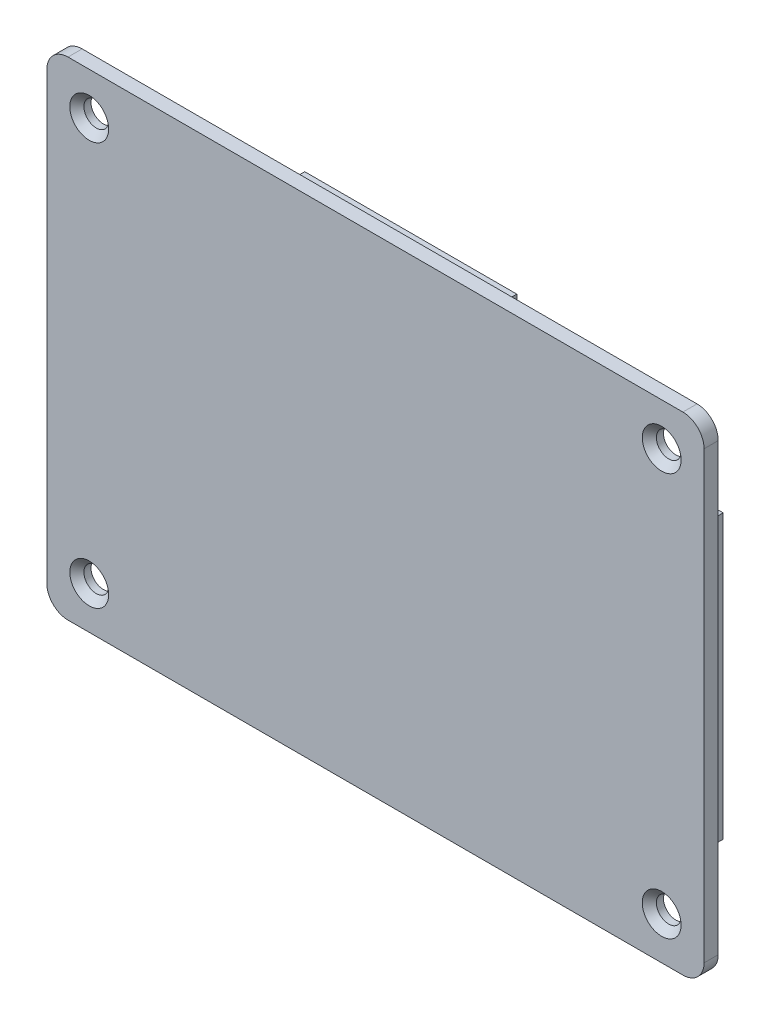
ISO-10303-21;
HEADER;
FILE_DESCRIPTION(('STEP AP214'),'2;1');
FILE_NAME('part.step','',(''),(''),'','','');
FILE_SCHEMA(('AUTOMOTIVE_DESIGN { 1 0 10303 214 1 1 1 1 }'));
ENDSEC;
DATA;
#1=APPLICATION_CONTEXT('core data for automotive mechanical design processes');
#2=APPLICATION_PROTOCOL_DEFINITION('international standard','automotive_design',2000,#1);
#3=PRODUCT_CONTEXT('',#1,'mechanical');
#4=PRODUCT('Part','Part','',(#3));
#5=PRODUCT_RELATED_PRODUCT_CATEGORY('part','',(#4));
#6=PRODUCT_DEFINITION_FORMATION('','',#4);
#7=PRODUCT_DEFINITION_CONTEXT('part definition',#1,'design');
#8=PRODUCT_DEFINITION('design','',#6,#7);
#9=PRODUCT_DEFINITION_SHAPE('','',#8);
#10=(LENGTH_UNIT() NAMED_UNIT(*) SI_UNIT(.MILLI.,.METRE.));
#11=(NAMED_UNIT(*) PLANE_ANGLE_UNIT() SI_UNIT($,.RADIAN.));
#12=(NAMED_UNIT(*) SI_UNIT($,.STERADIAN.) SOLID_ANGLE_UNIT());
#13=UNCERTAINTY_MEASURE_WITH_UNIT(LENGTH_MEASURE(1.E-05),#10,'distance_accuracy_value','');
#14=(GEOMETRIC_REPRESENTATION_CONTEXT(3) GLOBAL_UNCERTAINTY_ASSIGNED_CONTEXT((#13)) GLOBAL_UNIT_ASSIGNED_CONTEXT((#10,
#11,#12)) REPRESENTATION_CONTEXT('',''));
#15=CARTESIAN_POINT('',(0.,0.,0.));
#16=DIRECTION('',(0.,0.,1.));
#17=DIRECTION('',(1.,0.,0.));
#18=AXIS2_PLACEMENT_3D('',#15,#16,#17);
#19=CARTESIAN_POINT('',(62.230528187675,-22.7531322658769,0.));
#20=DIRECTION('',(0.,0.,1.));
#21=DIRECTION('',(1.,0.,0.));
#22=AXIS2_PLACEMENT_3D('',#19,#20,#21);
#23=PLANE('',#22);
#24=CARTESIAN_POINT('',(59.2305281876754,-82.7531332658758,0.));
#25=DIRECTION('',(0.,0.,-1.));
#26=DIRECTION('',(-1.,0.,0.));
#27=AXIS2_PLACEMENT_3D('',#24,#25,#26);
#28=CIRCLE('',#27,1.75);
#29=CARTESIAN_POINT('',(57.4805281876753,-82.7531332658758,0.));
#30=VERTEX_POINT('',#29);
#31=EDGE_CURVE('E469',#30,#30,#28,.T.);
#32=ORIENTED_EDGE('',*,*,#31,.F.);
#33=EDGE_LOOP('',(#32));
#34=FACE_BOUND('',#33,.T.);
#35=CARTESIAN_POINT('',(-21.7694704923239,-82.7531332658761,0.));
#36=DIRECTION('',(0.,0.,-1.));
#37=DIRECTION('',(-1.,0.,0.));
#38=AXIS2_PLACEMENT_3D('',#35,#36,#37);
#39=CIRCLE('',#38,1.75);
#40=CARTESIAN_POINT('',(-23.5194704923239,-82.7531332658761,0.));
#41=VERTEX_POINT('',#40);
#42=EDGE_CURVE('E470',#41,#41,#39,.T.);
#43=ORIENTED_EDGE('',*,*,#42,.F.);
#44=EDGE_LOOP('',(#43));
#45=FACE_BOUND('',#44,.T.);
#46=CARTESIAN_POINT('',(-21.7694707064445,-25.703133911756,0.));
#47=DIRECTION('',(0.,0.,-1.));
#48=DIRECTION('',(-1.,0.,0.));
#49=AXIS2_PLACEMENT_3D('',#46,#47,#48);
#50=CIRCLE('',#49,1.75);
#51=CARTESIAN_POINT('',(-23.5194707064445,-25.703133911756,0.));
#52=VERTEX_POINT('',#51);
#53=EDGE_CURVE('E473',#52,#52,#50,.T.);
#54=ORIENTED_EDGE('',*,*,#53,.F.);
#55=EDGE_LOOP('',(#54));
#56=FACE_BOUND('',#55,.T.);
#57=CARTESIAN_POINT('',(59.2305281876754,-25.7531322658771,0.));
#58=DIRECTION('',(0.,0.,-1.));
#59=DIRECTION('',(-1.,0.,0.));
#60=AXIS2_PLACEMENT_3D('',#57,#58,#59);
#61=CIRCLE('',#60,1.75);
#62=CARTESIAN_POINT('',(57.4805281876754,-25.7531322658771,0.));
#63=VERTEX_POINT('',#62);
#64=EDGE_CURVE('E477',#63,#63,#61,.T.);
#65=ORIENTED_EDGE('',*,*,#64,.F.);
#66=EDGE_LOOP('',(#65));
#67=FACE_BOUND('',#66,.T.);
#68=DIRECTION('',(0.,1.,0.));
#69=VECTOR('',#68,1.);
#70=CARTESIAN_POINT('',(3.73052884767558,-24.0531322658769,0.));
#71=LINE('',#70,#69);
#72=CARTESIAN_POINT('',(3.73052884767558,-24.0531322658769,0.));
#73=VERTEX_POINT('',#72);
#74=CARTESIAN_POINT('',(3.73052884767558,-22.0531322658769,0.));
#75=VERTEX_POINT('',#74);
#76=EDGE_CURVE('E215',#73,#75,#71,.T.);
#77=ORIENTED_EDGE('',*,*,#76,.F.);
#78=DIRECTION('',(-1.,0.,0.));
#79=VECTOR('',#78,1.);
#80=CARTESIAN_POINT('',(33.7305288476756,-24.0531322658769,0.));
#81=LINE('',#80,#79);
#82=CARTESIAN_POINT('',(33.7305288476756,-24.0531322658769,0.));
#83=VERTEX_POINT('',#82);
#84=EDGE_CURVE('E228',#83,#73,#81,.T.);
#85=ORIENTED_EDGE('',*,*,#84,.F.);
#86=DIRECTION('',(0.,-1.,0.));
#87=VECTOR('',#86,1.);
#88=CARTESIAN_POINT('',(33.7305288476756,-24.0531322658769,0.));
#89=LINE('',#88,#87);
#90=CARTESIAN_POINT('',(33.7305288476756,-22.0531322658769,0.));
#91=VERTEX_POINT('',#90);
#92=EDGE_CURVE('E237',#91,#83,#89,.T.);
#93=ORIENTED_EDGE('',*,*,#92,.F.);
#94=DIRECTION('',(1.,0.,0.));
#95=VECTOR('',#94,1.);
#96=CARTESIAN_POINT('',(33.7305288476756,-22.0531322658769,0.));
#97=LINE('',#96,#95);
#98=EDGE_CURVE('E218',#75,#91,#97,.T.);
#99=ORIENTED_EDGE('',*,*,#98,.F.);
#100=EDGE_LOOP('',(#77,#85,#93,#99));
#101=FACE_BOUND('',#100,.T.);
#102=DIRECTION('',(0.,-1.,0.));
#103=VECTOR('',#102,1.);
#104=CARTESIAN_POINT('',(62.930528187675,-74.2531327658765,0.));
#105=LINE('',#104,#103);
#106=CARTESIAN_POINT('',(62.930528187675,-34.2531327658765,0.));
#107=VERTEX_POINT('',#106);
#108=CARTESIAN_POINT('',(62.930528187675,-74.2531327658765,0.));
#109=VERTEX_POINT('',#108);
#110=EDGE_CURVE('E286',#107,#109,#105,.T.);
#111=ORIENTED_EDGE('',*,*,#110,.F.);
#112=DIRECTION('',(1.,0.,0.));
#113=VECTOR('',#112,1.);
#114=CARTESIAN_POINT('',(62.930528187675,-34.2531327658765,0.));
#115=LINE('',#114,#113);
#116=CARTESIAN_POINT('',(60.930528187675,-34.2531327658765,0.));
#117=VERTEX_POINT('',#116);
#118=EDGE_CURVE('E291',#117,#107,#115,.T.);
#119=ORIENTED_EDGE('',*,*,#118,.F.);
#120=DIRECTION('',(0.,1.,0.));
#121=VECTOR('',#120,1.);
#122=CARTESIAN_POINT('',(60.930528187675,-74.2531327658765,0.));
#123=LINE('',#122,#121);
#124=CARTESIAN_POINT('',(60.930528187675,-74.2531327658765,0.));
#125=VERTEX_POINT('',#124);
#126=EDGE_CURVE('E303',#125,#117,#123,.T.);
#127=ORIENTED_EDGE('',*,*,#126,.F.);
#128=DIRECTION('',(-1.,0.,0.));
#129=VECTOR('',#128,1.);
#130=CARTESIAN_POINT('',(62.930528187675,-74.2531327658765,0.));
#131=LINE('',#130,#129);
#132=EDGE_CURVE('E300',#109,#125,#131,.T.);
#133=ORIENTED_EDGE('',*,*,#132,.F.);
#134=EDGE_LOOP('',(#111,#119,#127,#133));
#135=FACE_BOUND('',#134,.T.);
#136=CARTESIAN_POINT('',(62.230528187675,-22.7531322658769,0.));
#137=DIRECTION('',(0.,0.,1.));
#138=DIRECTION('',(1.,0.,0.));
#139=AXIS2_PLACEMENT_3D('',#136,#137,#138);
#140=CIRCLE('',#139,3.00000000000001);
#141=CARTESIAN_POINT('',(65.230528187675,-22.7531322658769,0.));
#142=VERTEX_POINT('',#141);
#143=CARTESIAN_POINT('',(62.230528187675,-19.7531322658769,0.));
#144=VERTEX_POINT('',#143);
#145=EDGE_CURVE('E319',#142,#144,#140,.T.);
#146=ORIENTED_EDGE('',*,*,#145,.F.);
#147=DIRECTION('',(0.,1.,0.));
#148=VECTOR('',#147,1.);
#149=CARTESIAN_POINT('',(65.230528187675,-85.7531332658761,0.));
#150=LINE('',#149,#148);
#151=CARTESIAN_POINT('',(65.230528187675,-85.7531332658761,0.));
#152=VERTEX_POINT('',#151);
#153=EDGE_CURVE('E324',#152,#142,#150,.T.);
#154=ORIENTED_EDGE('',*,*,#153,.F.);
#155=CARTESIAN_POINT('',(62.230528187675,-85.7531332658761,0.));
#156=DIRECTION('',(0.,0.,1.));
#157=DIRECTION('',(1.,0.,0.));
#158=AXIS2_PLACEMENT_3D('',#155,#156,#157);
#159=CIRCLE('',#158,3.00000000000002);
#160=CARTESIAN_POINT('',(62.230528187675,-88.7531332658761,0.));
#161=VERTEX_POINT('',#160);
#162=EDGE_CURVE('E351',#161,#152,#159,.T.);
#163=ORIENTED_EDGE('',*,*,#162,.F.);
#164=DIRECTION('',(1.,0.,0.));
#165=VECTOR('',#164,1.);
#166=CARTESIAN_POINT('',(-24.7694704923239,-88.7531332658761,0.));
#167=LINE('',#166,#165);
#168=CARTESIAN_POINT('',(-24.7694704923239,-88.7531332658761,0.));
#169=VERTEX_POINT('',#168);
#170=EDGE_CURVE('E349',#169,#161,#167,.T.);
#171=ORIENTED_EDGE('',*,*,#170,.F.);
#172=CARTESIAN_POINT('',(-24.7694704923239,-85.7531332658761,0.));
#173=DIRECTION('',(0.,0.,1.));
#174=DIRECTION('',(1.,0.,0.));
#175=AXIS2_PLACEMENT_3D('',#172,#173,#174);
#176=CIRCLE('',#175,3.00000000000002);
#177=CARTESIAN_POINT('',(-27.7694704923239,-85.7531332658761,0.));
#178=VERTEX_POINT('',#177);
#179=EDGE_CURVE('E347',#178,#169,#176,.T.);
#180=ORIENTED_EDGE('',*,*,#179,.F.);
#181=DIRECTION('',(0.,-1.,0.));
#182=VECTOR('',#181,1.);
#183=CARTESIAN_POINT('',(-27.7694704923239,-22.7531322658769,0.));
#184=LINE('',#183,#182);
#185=CARTESIAN_POINT('',(-27.7694704923239,-22.7531322658769,0.));
#186=VERTEX_POINT('',#185);
#187=EDGE_CURVE('E345',#186,#178,#184,.T.);
#188=ORIENTED_EDGE('',*,*,#187,.F.);
#189=CARTESIAN_POINT('',(-24.7694704923239,-22.7531322658769,0.));
#190=DIRECTION('',(0.,0.,1.));
#191=DIRECTION('',(1.,0.,0.));
#192=AXIS2_PLACEMENT_3D('',#189,#190,#191);
#193=CIRCLE('',#192,3.00000000000003);
#194=CARTESIAN_POINT('',(-24.7694704923239,-19.7531322658769,0.));
#195=VERTEX_POINT('',#194);
#196=EDGE_CURVE('E343',#195,#186,#193,.T.);
#197=ORIENTED_EDGE('',*,*,#196,.F.);
#198=DIRECTION('',(-1.,0.,0.));
#199=VECTOR('',#198,1.);
#200=CARTESIAN_POINT('',(62.230528187675,-19.7531322658769,0.));
#201=LINE('',#200,#199);
#202=EDGE_CURVE('E341',#144,#195,#201,.T.);
#203=ORIENTED_EDGE('',*,*,#202,.F.);
#204=EDGE_LOOP('',(#146,#154,#163,#171,#180,#188,#197,#203));
#205=FACE_BOUND('',#204,.T.);
#206=DIRECTION('',(-1.,0.,0.));
#207=VECTOR('',#206,1.);
#208=CARTESIAN_POINT('',(-25.4694704923239,-74.2531327658765,0.));
#209=LINE('',#208,#207);
#210=CARTESIAN_POINT('',(-23.4694704923239,-74.2531327658765,0.));
#211=VERTEX_POINT('',#210);
#212=CARTESIAN_POINT('',(-25.4694704923239,-74.2531327658765,0.));
#213=VERTEX_POINT('',#212);
#214=EDGE_CURVE('E253',#211,#213,#209,.T.);
#215=ORIENTED_EDGE('',*,*,#214,.F.);
#216=DIRECTION('',(0.,-1.,0.));
#217=VECTOR('',#216,1.);
#218=CARTESIAN_POINT('',(-23.4694704923239,-74.2531327658765,0.));
#219=LINE('',#218,#217);
#220=CARTESIAN_POINT('',(-23.4694704923239,-34.2531327658765,0.));
#221=VERTEX_POINT('',#220);
#222=EDGE_CURVE('E258',#221,#211,#219,.T.);
#223=ORIENTED_EDGE('',*,*,#222,.F.);
#224=DIRECTION('',(1.,0.,0.));
#225=VECTOR('',#224,1.);
#226=CARTESIAN_POINT('',(-25.4694704923239,-34.2531327658765,0.));
#227=LINE('',#226,#225);
#228=CARTESIAN_POINT('',(-25.4694704923239,-34.2531327658765,0.));
#229=VERTEX_POINT('',#228);
#230=EDGE_CURVE('E270',#229,#221,#227,.T.);
#231=ORIENTED_EDGE('',*,*,#230,.F.);
#232=DIRECTION('',(0.,1.,0.));
#233=VECTOR('',#232,1.);
#234=CARTESIAN_POINT('',(-25.4694704923239,-74.2531327658765,0.));
#235=LINE('',#234,#233);
#236=EDGE_CURVE('E267',#213,#229,#235,.T.);
#237=ORIENTED_EDGE('',*,*,#236,.F.);
#238=EDGE_LOOP('',(#215,#223,#231,#237));
#239=FACE_BOUND('',#238,.T.);
#240=DIRECTION('',(0.,-1.,0.));
#241=VECTOR('',#240,1.);
#242=CARTESIAN_POINT('',(33.7305288476756,-84.4531332658761,0.));
#243=LINE('',#242,#241);
#244=CARTESIAN_POINT('',(33.7305288476756,-84.4531332658761,0.));
#245=VERTEX_POINT('',#244);
#246=CARTESIAN_POINT('',(33.7305288476756,-86.4531332658761,0.));
#247=VERTEX_POINT('',#246);
#248=EDGE_CURVE('E214',#245,#247,#243,.T.);
#249=ORIENTED_EDGE('',*,*,#248,.F.);
#250=DIRECTION('',(1.,0.,0.));
#251=VECTOR('',#250,1.);
#252=CARTESIAN_POINT('',(33.7305288476756,-84.4531332658761,0.));
#253=LINE('',#252,#251);
#254=CARTESIAN_POINT('',(3.73052884767557,-84.4531332658761,0.));
#255=VERTEX_POINT('',#254);
#256=EDGE_CURVE('E211',#255,#245,#253,.T.);
#257=ORIENTED_EDGE('',*,*,#256,.F.);
#258=DIRECTION('',(0.,1.,0.));
#259=VECTOR('',#258,1.);
#260=CARTESIAN_POINT('',(3.73052884767557,-84.4531332658761,0.));
#261=LINE('',#260,#259);
#262=CARTESIAN_POINT('',(3.73052884767557,-86.4531332658761,0.));
#263=VERTEX_POINT('',#262);
#264=EDGE_CURVE('E53',#263,#255,#261,.T.);
#265=ORIENTED_EDGE('',*,*,#264,.F.);
#266=DIRECTION('',(-1.,0.,0.));
#267=VECTOR('',#266,1.);
#268=CARTESIAN_POINT('',(33.7305288476756,-86.4531332658761,0.));
#269=LINE('',#268,#267);
#270=EDGE_CURVE('E48',#247,#263,#269,.T.);
#271=ORIENTED_EDGE('',*,*,#270,.F.);
#272=EDGE_LOOP('',(#249,#257,#265,#271));
#273=FACE_BOUND('',#272,.T.);
#274=ADVANCED_FACE('F33',(#34,#45,#56,#67,#101,#135,#205,#239,#273),#23,.F.);
#275=CARTESIAN_POINT('',(62.230528187675,-22.7531322658769,2.));
#276=DIRECTION('',(0.,0.,-1.));
#277=DIRECTION('',(-1.,0.,0.));
#278=AXIS2_PLACEMENT_3D('',#275,#276,#277);
#279=CYLINDRICAL_SURFACE('',#278,3.00000000000001);
#280=ORIENTED_EDGE('',*,*,#145,.T.);
#281=DIRECTION('',(0.,0.,-1.));
#282=VECTOR('',#281,1.);
#283=CARTESIAN_POINT('',(62.230528187675,-19.7531322658769,2.));
#284=LINE('',#283,#282);
#285=CARTESIAN_POINT('',(62.230528187675,-19.7531322658769,2.));
#286=VERTEX_POINT('',#285);
#287=EDGE_CURVE('E374',#286,#144,#284,.T.);
#288=ORIENTED_EDGE('',*,*,#287,.F.);
#289=CARTESIAN_POINT('',(62.230528187675,-22.7531322658769,2.));
#290=DIRECTION('',(0.,0.,1.));
#291=DIRECTION('',(1.,0.,0.));
#292=AXIS2_PLACEMENT_3D('',#289,#290,#291);
#293=CIRCLE('',#292,3.00000000000001);
#294=CARTESIAN_POINT('',(65.230528187675,-22.7531322658769,2.));
#295=VERTEX_POINT('',#294);
#296=EDGE_CURVE('E320',#295,#286,#293,.T.);
#297=ORIENTED_EDGE('',*,*,#296,.F.);
#298=DIRECTION('',(0.,0.,-1.));
#299=VECTOR('',#298,1.);
#300=CARTESIAN_POINT('',(65.230528187675,-22.7531322658769,2.));
#301=LINE('',#300,#299);
#302=EDGE_CURVE('E338',#295,#142,#301,.T.);
#303=ORIENTED_EDGE('',*,*,#302,.T.);
#304=EDGE_LOOP('',(#280,#288,#297,#303));
#305=FACE_BOUND('',#304,.T.);
#306=ADVANCED_FACE('F414',(#305),#279,.T.);
#307=CARTESIAN_POINT('',(62.230528187675,-19.7531322658769,2.));
#308=DIRECTION('',(0.,-1.,0.));
#309=DIRECTION('',(0.,0.,-1.));
#310=AXIS2_PLACEMENT_3D('',#307,#308,#309);
#311=PLANE('',#310);
#312=ORIENTED_EDGE('',*,*,#202,.T.);
#313=DIRECTION('',(0.,0.,-1.));
#314=VECTOR('',#313,1.);
#315=CARTESIAN_POINT('',(-24.7694704923239,-19.7531322658769,2.));
#316=LINE('',#315,#314);
#317=CARTESIAN_POINT('',(-24.7694704923239,-19.7531322658769,2.));
#318=VERTEX_POINT('',#317);
#319=EDGE_CURVE('E371',#318,#195,#316,.T.);
#320=ORIENTED_EDGE('',*,*,#319,.F.);
#321=DIRECTION('',(-1.,0.,0.));
#322=VECTOR('',#321,1.);
#323=CARTESIAN_POINT('',(62.230528187675,-19.7531322658769,2.));
#324=LINE('',#323,#322);
#325=EDGE_CURVE('E323',#286,#318,#324,.T.);
#326=ORIENTED_EDGE('',*,*,#325,.F.);
#327=ORIENTED_EDGE('',*,*,#287,.T.);
#328=EDGE_LOOP('',(#312,#320,#326,#327));
#329=FACE_BOUND('',#328,.T.);
#330=ADVANCED_FACE('F420',(#329),#311,.F.);
#331=CARTESIAN_POINT('',(-24.7694704923239,-22.7531322658769,2.));
#332=DIRECTION('',(0.,0.,-1.));
#333=DIRECTION('',(-1.,0.,0.));
#334=AXIS2_PLACEMENT_3D('',#331,#332,#333);
#335=CYLINDRICAL_SURFACE('',#334,3.00000000000003);
#336=ORIENTED_EDGE('',*,*,#196,.T.);
#337=DIRECTION('',(0.,0.,-1.));
#338=VECTOR('',#337,1.);
#339=CARTESIAN_POINT('',(-27.7694704923239,-22.7531322658769,2.));
#340=LINE('',#339,#338);
#341=CARTESIAN_POINT('',(-27.7694704923239,-22.7531322658769,2.));
#342=VERTEX_POINT('',#341);
#343=EDGE_CURVE('E368',#342,#186,#340,.T.);
#344=ORIENTED_EDGE('',*,*,#343,.F.);
#345=CARTESIAN_POINT('',(-24.7694704923239,-22.7531322658769,2.));
#346=DIRECTION('',(0.,0.,1.));
#347=DIRECTION('',(1.,0.,0.));
#348=AXIS2_PLACEMENT_3D('',#345,#346,#347);
#349=CIRCLE('',#348,3.00000000000003);
#350=EDGE_CURVE('E326',#318,#342,#349,.T.);
#351=ORIENTED_EDGE('',*,*,#350,.F.);
#352=ORIENTED_EDGE('',*,*,#319,.T.);
#353=EDGE_LOOP('',(#336,#344,#351,#352));
#354=FACE_BOUND('',#353,.T.);
#355=ADVANCED_FACE('F448',(#354),#335,.T.);
#356=CARTESIAN_POINT('',(-27.7694704923239,-22.7531322658769,2.));
#357=DIRECTION('',(1.,0.,0.));
#358=DIRECTION('',(0.,0.,-1.));
#359=AXIS2_PLACEMENT_3D('',#356,#357,#358);
#360=PLANE('',#359);
#361=ORIENTED_EDGE('',*,*,#187,.T.);
#362=DIRECTION('',(0.,0.,-1.));
#363=VECTOR('',#362,1.);
#364=CARTESIAN_POINT('',(-27.7694704923239,-85.7531332658761,2.));
#365=LINE('',#364,#363);
#366=CARTESIAN_POINT('',(-27.7694704923239,-85.7531332658761,2.));
#367=VERTEX_POINT('',#366);
#368=EDGE_CURVE('E365',#367,#178,#365,.T.);
#369=ORIENTED_EDGE('',*,*,#368,.F.);
#370=DIRECTION('',(0.,-1.,0.));
#371=VECTOR('',#370,1.);
#372=CARTESIAN_POINT('',(-27.7694704923239,-22.7531322658769,2.));
#373=LINE('',#372,#371);
#374=EDGE_CURVE('E328',#342,#367,#373,.T.);
#375=ORIENTED_EDGE('',*,*,#374,.F.);
#376=ORIENTED_EDGE('',*,*,#343,.T.);
#377=EDGE_LOOP('',(#361,#369,#375,#376));
#378=FACE_BOUND('',#377,.T.);
#379=ADVANCED_FACE('F444',(#378),#360,.F.);
#380=CARTESIAN_POINT('',(-24.7694704923239,-85.7531332658761,2.));
#381=DIRECTION('',(0.,0.,-1.));
#382=DIRECTION('',(-1.,0.,0.));
#383=AXIS2_PLACEMENT_3D('',#380,#381,#382);
#384=CYLINDRICAL_SURFACE('',#383,3.00000000000002);
#385=ORIENTED_EDGE('',*,*,#179,.T.);
#386=DIRECTION('',(0.,0.,-1.));
#387=VECTOR('',#386,1.);
#388=CARTESIAN_POINT('',(-24.7694704923239,-88.7531332658761,2.));
#389=LINE('',#388,#387);
#390=CARTESIAN_POINT('',(-24.7694704923239,-88.7531332658761,2.));
#391=VERTEX_POINT('',#390);
#392=EDGE_CURVE('E362',#391,#169,#389,.T.);
#393=ORIENTED_EDGE('',*,*,#392,.F.);
#394=CARTESIAN_POINT('',(-24.7694704923239,-85.7531332658761,2.));
#395=DIRECTION('',(0.,0.,1.));
#396=DIRECTION('',(1.,0.,0.));
#397=AXIS2_PLACEMENT_3D('',#394,#395,#396);
#398=CIRCLE('',#397,3.00000000000002);
#399=EDGE_CURVE('E330',#367,#391,#398,.T.);
#400=ORIENTED_EDGE('',*,*,#399,.F.);
#401=ORIENTED_EDGE('',*,*,#368,.T.);
#402=EDGE_LOOP('',(#385,#393,#400,#401));
#403=FACE_BOUND('',#402,.T.);
#404=ADVANCED_FACE('F440',(#403),#384,.T.);
#405=CARTESIAN_POINT('',(-24.7694704923239,-88.7531332658761,2.));
#406=DIRECTION('',(0.,1.,0.));
#407=DIRECTION('',(0.,0.,1.));
#408=AXIS2_PLACEMENT_3D('',#405,#406,#407);
#409=PLANE('',#408);
#410=ORIENTED_EDGE('',*,*,#170,.T.);
#411=DIRECTION('',(0.,0.,-1.));
#412=VECTOR('',#411,1.);
#413=CARTESIAN_POINT('',(62.230528187675,-88.7531332658761,2.));
#414=LINE('',#413,#412);
#415=CARTESIAN_POINT('',(62.230528187675,-88.7531332658761,2.));
#416=VERTEX_POINT('',#415);
#417=EDGE_CURVE('E359',#416,#161,#414,.T.);
#418=ORIENTED_EDGE('',*,*,#417,.F.);
#419=DIRECTION('',(1.,0.,0.));
#420=VECTOR('',#419,1.);
#421=CARTESIAN_POINT('',(-24.7694704923239,-88.7531332658761,2.));
#422=LINE('',#421,#420);
#423=EDGE_CURVE('E332',#391,#416,#422,.T.);
#424=ORIENTED_EDGE('',*,*,#423,.F.);
#425=ORIENTED_EDGE('',*,*,#392,.T.);
#426=EDGE_LOOP('',(#410,#418,#424,#425));
#427=FACE_BOUND('',#426,.T.);
#428=ADVANCED_FACE('F436',(#427),#409,.F.);
#429=CARTESIAN_POINT('',(62.230528187675,-85.7531332658761,2.));
#430=DIRECTION('',(0.,0.,-1.));
#431=DIRECTION('',(-1.,0.,0.));
#432=AXIS2_PLACEMENT_3D('',#429,#430,#431);
#433=CYLINDRICAL_SURFACE('',#432,3.00000000000002);
#434=ORIENTED_EDGE('',*,*,#162,.T.);
#435=DIRECTION('',(0.,0.,-1.));
#436=VECTOR('',#435,1.);
#437=CARTESIAN_POINT('',(65.230528187675,-85.7531332658761,2.));
#438=LINE('',#437,#436);
#439=CARTESIAN_POINT('',(65.230528187675,-85.7531332658761,2.));
#440=VERTEX_POINT('',#439);
#441=EDGE_CURVE('E356',#440,#152,#438,.T.);
#442=ORIENTED_EDGE('',*,*,#441,.F.);
#443=CARTESIAN_POINT('',(62.230528187675,-85.7531332658761,2.));
#444=DIRECTION('',(0.,0.,1.));
#445=DIRECTION('',(1.,0.,0.));
#446=AXIS2_PLACEMENT_3D('',#443,#444,#445);
#447=CIRCLE('',#446,3.00000000000002);
#448=EDGE_CURVE('E334',#416,#440,#447,.T.);
#449=ORIENTED_EDGE('',*,*,#448,.F.);
#450=ORIENTED_EDGE('',*,*,#417,.T.);
#451=EDGE_LOOP('',(#434,#442,#449,#450));
#452=FACE_BOUND('',#451,.T.);
#453=ADVANCED_FACE('F432',(#452),#433,.T.);
#454=CARTESIAN_POINT('',(65.230528187675,-85.7531332658761,2.));
#455=DIRECTION('',(-1.,0.,0.));
#456=DIRECTION('',(0.,0.,1.));
#457=AXIS2_PLACEMENT_3D('',#454,#455,#456);
#458=PLANE('',#457);
#459=ORIENTED_EDGE('',*,*,#153,.T.);
#460=ORIENTED_EDGE('',*,*,#302,.F.);
#461=DIRECTION('',(0.,1.,0.));
#462=VECTOR('',#461,1.);
#463=CARTESIAN_POINT('',(65.230528187675,-85.7531332658761,2.));
#464=LINE('',#463,#462);
#465=EDGE_CURVE('E336',#440,#295,#464,.T.);
#466=ORIENTED_EDGE('',*,*,#465,.F.);
#467=ORIENTED_EDGE('',*,*,#441,.T.);
#468=EDGE_LOOP('',(#459,#460,#466,#467));
#469=FACE_BOUND('',#468,.T.);
#470=ADVANCED_FACE('F429',(#469),#458,.F.);
#471=CARTESIAN_POINT('',(62.230528187675,-22.7531322658769,2.));
#472=DIRECTION('',(0.,0.,1.));
#473=DIRECTION('',(1.,0.,0.));
#474=AXIS2_PLACEMENT_3D('',#471,#472,#473);
#475=PLANE('',#474);
#476=CARTESIAN_POINT('',(59.2305281876754,-82.7531332658758,2.));
#477=DIRECTION('',(0.,0.,1.));
#478=DIRECTION('',(1.,0.,0.));
#479=AXIS2_PLACEMENT_3D('',#476,#477,#478);
#480=CIRCLE('',#479,2.75);
#481=CARTESIAN_POINT('',(61.9805281876754,-82.7531332658758,2.));
#482=VERTEX_POINT('',#481);
#483=EDGE_CURVE('E389',#482,#482,#480,.F.);
#484=ORIENTED_EDGE('',*,*,#483,.T.);
#485=EDGE_LOOP('',(#484));
#486=FACE_BOUND('',#485,.T.);
#487=CARTESIAN_POINT('',(59.2305281876754,-25.7531322658771,2.));
#488=DIRECTION('',(0.,0.,1.));
#489=DIRECTION('',(1.,0.,0.));
#490=AXIS2_PLACEMENT_3D('',#487,#488,#489);
#491=CIRCLE('',#490,2.75);
#492=CARTESIAN_POINT('',(61.9805281876754,-25.7531322658771,2.));
#493=VERTEX_POINT('',#492);
#494=EDGE_CURVE('E386',#493,#493,#491,.F.);
#495=ORIENTED_EDGE('',*,*,#494,.T.);
#496=EDGE_LOOP('',(#495));
#497=FACE_BOUND('',#496,.T.);
#498=CARTESIAN_POINT('',(-21.7694704923239,-82.7531332658761,2.));
#499=DIRECTION('',(0.,0.,1.));
#500=DIRECTION('',(1.,0.,0.));
#501=AXIS2_PLACEMENT_3D('',#498,#499,#500);
#502=CIRCLE('',#501,2.75);
#503=CARTESIAN_POINT('',(-19.0194704923239,-82.7531332658761,2.));
#504=VERTEX_POINT('',#503);
#505=EDGE_CURVE('E383',#504,#504,#502,.F.);
#506=ORIENTED_EDGE('',*,*,#505,.T.);
#507=EDGE_LOOP('',(#506));
#508=FACE_BOUND('',#507,.T.);
#509=CARTESIAN_POINT('',(-21.7694707064445,-25.703133911756,2.));
#510=DIRECTION('',(0.,0.,1.));
#511=DIRECTION('',(1.,0.,0.));
#512=AXIS2_PLACEMENT_3D('',#509,#510,#511);
#513=CIRCLE('',#512,2.75);
#514=CARTESIAN_POINT('',(-19.0194707064445,-25.703133911756,2.));
#515=VERTEX_POINT('',#514);
#516=EDGE_CURVE('E380',#515,#515,#513,.F.);
#517=ORIENTED_EDGE('',*,*,#516,.T.);
#518=EDGE_LOOP('',(#517));
#519=FACE_BOUND('',#518,.T.);
#520=ORIENTED_EDGE('',*,*,#296,.T.);
#521=ORIENTED_EDGE('',*,*,#325,.T.);
#522=ORIENTED_EDGE('',*,*,#350,.T.);
#523=ORIENTED_EDGE('',*,*,#374,.T.);
#524=ORIENTED_EDGE('',*,*,#399,.T.);
#525=ORIENTED_EDGE('',*,*,#423,.T.);
#526=ORIENTED_EDGE('',*,*,#448,.T.);
#527=ORIENTED_EDGE('',*,*,#465,.T.);
#528=EDGE_LOOP('',(#520,#521,#522,#523,#524,#525,#526,#527));
#529=FACE_BOUND('',#528,.T.);
#530=ADVANCED_FACE('F427',(#486,#497,#508,#519,#529),#475,.T.);
#531=CARTESIAN_POINT('',(62.930528187675,-74.2531327658765,-3.));
#532=DIRECTION('',(-1.,0.,0.));
#533=DIRECTION('',(0.,0.,1.));
#534=AXIS2_PLACEMENT_3D('',#531,#532,#533);
#535=PLANE('',#534);
#536=ORIENTED_EDGE('',*,*,#110,.T.);
#537=DIRECTION('',(0.,0.,1.));
#538=VECTOR('',#537,1.);
#539=CARTESIAN_POINT('',(62.930528187675,-74.2531327658765,-3.));
#540=LINE('',#539,#538);
#541=CARTESIAN_POINT('',(62.930528187675,-74.2531327658765,-3.));
#542=VERTEX_POINT('',#541);
#543=EDGE_CURVE('E316',#542,#109,#540,.T.);
#544=ORIENTED_EDGE('',*,*,#543,.F.);
#545=DIRECTION('',(0.,-1.,0.));
#546=VECTOR('',#545,1.);
#547=CARTESIAN_POINT('',(62.930528187675,-74.2531327658765,-3.));
#548=LINE('',#547,#546);
#549=CARTESIAN_POINT('',(62.930528187675,-34.2531327658765,-3.));
#550=VERTEX_POINT('',#549);
#551=EDGE_CURVE('E287',#550,#542,#548,.T.);
#552=ORIENTED_EDGE('',*,*,#551,.F.);
#553=DIRECTION('',(0.,0.,1.));
#554=VECTOR('',#553,1.);
#555=CARTESIAN_POINT('',(62.930528187675,-34.2531327658765,-3.));
#556=LINE('',#555,#554);
#557=EDGE_CURVE('E297',#550,#107,#556,.T.);
#558=ORIENTED_EDGE('',*,*,#557,.T.);
#559=EDGE_LOOP('',(#536,#544,#552,#558));
#560=FACE_BOUND('',#559,.T.);
#561=ADVANCED_FACE('F560',(#560),#535,.F.);
#562=CARTESIAN_POINT('',(62.930528187675,-74.2531327658765,-3.));
#563=DIRECTION('',(0.,1.,0.));
#564=DIRECTION('',(0.,0.,1.));
#565=AXIS2_PLACEMENT_3D('',#562,#563,#564);
#566=PLANE('',#565);
#567=ORIENTED_EDGE('',*,*,#132,.T.);
#568=DIRECTION('',(0.,0.,1.));
#569=VECTOR('',#568,1.);
#570=CARTESIAN_POINT('',(60.930528187675,-74.2531327658765,-3.));
#571=LINE('',#570,#569);
#572=CARTESIAN_POINT('',(60.930528187675,-74.2531327658765,-3.));
#573=VERTEX_POINT('',#572);
#574=EDGE_CURVE('E313',#573,#125,#571,.T.);
#575=ORIENTED_EDGE('',*,*,#574,.F.);
#576=DIRECTION('',(-1.,0.,0.));
#577=VECTOR('',#576,1.);
#578=CARTESIAN_POINT('',(62.930528187675,-74.2531327658765,-3.));
#579=LINE('',#578,#577);
#580=EDGE_CURVE('E290',#542,#573,#579,.T.);
#581=ORIENTED_EDGE('',*,*,#580,.F.);
#582=ORIENTED_EDGE('',*,*,#543,.T.);
#583=EDGE_LOOP('',(#567,#575,#581,#582));
#584=FACE_BOUND('',#583,.T.);
#585=ADVANCED_FACE('F557',(#584),#566,.F.);
#586=CARTESIAN_POINT('',(60.930528187675,-74.2531327658765,-3.));
#587=DIRECTION('',(1.,0.,0.));
#588=DIRECTION('',(0.,0.,-1.));
#589=AXIS2_PLACEMENT_3D('',#586,#587,#588);
#590=PLANE('',#589);
#591=ORIENTED_EDGE('',*,*,#126,.T.);
#592=DIRECTION('',(0.,0.,1.));
#593=VECTOR('',#592,1.);
#594=CARTESIAN_POINT('',(60.930528187675,-34.2531327658765,-3.));
#595=LINE('',#594,#593);
#596=CARTESIAN_POINT('',(60.930528187675,-34.2531327658765,-3.));
#597=VERTEX_POINT('',#596);
#598=EDGE_CURVE('E310',#597,#117,#595,.T.);
#599=ORIENTED_EDGE('',*,*,#598,.F.);
#600=DIRECTION('',(0.,1.,0.));
#601=VECTOR('',#600,1.);
#602=CARTESIAN_POINT('',(60.930528187675,-74.2531327658765,-3.));
#603=LINE('',#602,#601);
#604=EDGE_CURVE('E293',#573,#597,#603,.T.);
#605=ORIENTED_EDGE('',*,*,#604,.F.);
#606=ORIENTED_EDGE('',*,*,#574,.T.);
#607=EDGE_LOOP('',(#591,#599,#605,#606));
#608=FACE_BOUND('',#607,.T.);
#609=ADVANCED_FACE('F553',(#608),#590,.F.);
#610=CARTESIAN_POINT('',(62.930528187675,-34.2531327658765,-3.));
#611=DIRECTION('',(0.,-1.,0.));
#612=DIRECTION('',(1.,0.,0.));
#613=AXIS2_PLACEMENT_3D('',#610,#611,#612);
#614=PLANE('',#613);
#615=ORIENTED_EDGE('',*,*,#118,.T.);
#616=ORIENTED_EDGE('',*,*,#557,.F.);
#617=DIRECTION('',(1.,0.,0.));
#618=VECTOR('',#617,1.);
#619=CARTESIAN_POINT('',(62.930528187675,-34.2531327658765,-3.));
#620=LINE('',#619,#618);
#621=EDGE_CURVE('E295',#597,#550,#620,.T.);
#622=ORIENTED_EDGE('',*,*,#621,.F.);
#623=ORIENTED_EDGE('',*,*,#598,.T.);
#624=EDGE_LOOP('',(#615,#616,#622,#623));
#625=FACE_BOUND('',#624,.T.);
#626=ADVANCED_FACE('F549',(#625),#614,.F.);
#627=CARTESIAN_POINT('',(0.,0.,-3.));
#628=DIRECTION('',(0.,0.,1.));
#629=DIRECTION('',(1.,0.,0.));
#630=AXIS2_PLACEMENT_3D('',#627,#628,#629);
#631=PLANE('',#630);
#632=ORIENTED_EDGE('',*,*,#551,.T.);
#633=ORIENTED_EDGE('',*,*,#580,.T.);
#634=ORIENTED_EDGE('',*,*,#604,.T.);
#635=ORIENTED_EDGE('',*,*,#621,.T.);
#636=EDGE_LOOP('',(#632,#633,#634,#635));
#637=FACE_BOUND('',#636,.T.);
#638=ADVANCED_FACE('F545',(#637),#631,.F.);
#639=CARTESIAN_POINT('',(-25.4694704923239,-74.2531327658765,-3.));
#640=DIRECTION('',(0.,1.,0.));
#641=DIRECTION('',(0.,0.,1.));
#642=AXIS2_PLACEMENT_3D('',#639,#640,#641);
#643=PLANE('',#642);
#644=ORIENTED_EDGE('',*,*,#214,.T.);
#645=DIRECTION('',(0.,0.,1.));
#646=VECTOR('',#645,1.);
#647=CARTESIAN_POINT('',(-25.4694704923239,-74.2531327658765,-3.));
#648=LINE('',#647,#646);
#649=CARTESIAN_POINT('',(-25.4694704923239,-74.2531327658765,-3.));
#650=VERTEX_POINT('',#649);
#651=EDGE_CURVE('E283',#650,#213,#648,.T.);
#652=ORIENTED_EDGE('',*,*,#651,.F.);
#653=DIRECTION('',(-1.,0.,0.));
#654=VECTOR('',#653,1.);
#655=CARTESIAN_POINT('',(-25.4694704923239,-74.2531327658765,-3.));
#656=LINE('',#655,#654);
#657=CARTESIAN_POINT('',(-23.4694704923239,-74.2531327658765,-3.));
#658=VERTEX_POINT('',#657);
#659=EDGE_CURVE('E254',#658,#650,#656,.T.);
#660=ORIENTED_EDGE('',*,*,#659,.F.);
#661=DIRECTION('',(0.,0.,1.));
#662=VECTOR('',#661,1.);
#663=CARTESIAN_POINT('',(-23.4694704923239,-74.2531327658765,-3.));
#664=LINE('',#663,#662);
#665=EDGE_CURVE('E264',#658,#211,#664,.T.);
#666=ORIENTED_EDGE('',*,*,#665,.T.);
#667=EDGE_LOOP('',(#644,#652,#660,#666));
#668=FACE_BOUND('',#667,.T.);
#669=ADVANCED_FACE('F541',(#668),#643,.F.);
#670=CARTESIAN_POINT('',(-25.4694704923239,-74.2531327658765,-3.));
#671=DIRECTION('',(1.,0.,0.));
#672=DIRECTION('',(0.,0.,-1.));
#673=AXIS2_PLACEMENT_3D('',#670,#671,#672);
#674=PLANE('',#673);
#675=ORIENTED_EDGE('',*,*,#236,.T.);
#676=DIRECTION('',(0.,0.,1.));
#677=VECTOR('',#676,1.);
#678=CARTESIAN_POINT('',(-25.4694704923239,-34.2531327658765,-3.));
#679=LINE('',#678,#677);
#680=CARTESIAN_POINT('',(-25.4694704923239,-34.2531327658765,-3.));
#681=VERTEX_POINT('',#680);
#682=EDGE_CURVE('E280',#681,#229,#679,.T.);
#683=ORIENTED_EDGE('',*,*,#682,.F.);
#684=DIRECTION('',(0.,1.,0.));
#685=VECTOR('',#684,1.);
#686=CARTESIAN_POINT('',(-25.4694704923239,-74.2531327658765,-3.));
#687=LINE('',#686,#685);
#688=EDGE_CURVE('E257',#650,#681,#687,.T.);
#689=ORIENTED_EDGE('',*,*,#688,.F.);
#690=ORIENTED_EDGE('',*,*,#651,.T.);
#691=EDGE_LOOP('',(#675,#683,#689,#690));
#692=FACE_BOUND('',#691,.T.);
#693=ADVANCED_FACE('F537',(#692),#674,.F.);
#694=CARTESIAN_POINT('',(-25.4694704923239,-34.2531327658765,-3.));
#695=DIRECTION('',(0.,-1.,0.));
#696=DIRECTION('',(1.,0.,0.));
#697=AXIS2_PLACEMENT_3D('',#694,#695,#696);
#698=PLANE('',#697);
#699=ORIENTED_EDGE('',*,*,#230,.T.);
#700=DIRECTION('',(0.,0.,1.));
#701=VECTOR('',#700,1.);
#702=CARTESIAN_POINT('',(-23.4694704923239,-34.2531327658765,-3.));
#703=LINE('',#702,#701);
#704=CARTESIAN_POINT('',(-23.4694704923239,-34.2531327658765,-3.));
#705=VERTEX_POINT('',#704);
#706=EDGE_CURVE('E277',#705,#221,#703,.T.);
#707=ORIENTED_EDGE('',*,*,#706,.F.);
#708=DIRECTION('',(1.,0.,0.));
#709=VECTOR('',#708,1.);
#710=CARTESIAN_POINT('',(-25.4694704923239,-34.2531327658765,-3.));
#711=LINE('',#710,#709);
#712=EDGE_CURVE('E260',#681,#705,#711,.T.);
#713=ORIENTED_EDGE('',*,*,#712,.F.);
#714=ORIENTED_EDGE('',*,*,#682,.T.);
#715=EDGE_LOOP('',(#699,#707,#713,#714));
#716=FACE_BOUND('',#715,.T.);
#717=ADVANCED_FACE('F533',(#716),#698,.F.);
#718=CARTESIAN_POINT('',(-23.4694704923239,-74.2531327658765,-3.));
#719=DIRECTION('',(-1.,0.,0.));
#720=DIRECTION('',(0.,0.,1.));
#721=AXIS2_PLACEMENT_3D('',#718,#719,#720);
#722=PLANE('',#721);
#723=ORIENTED_EDGE('',*,*,#222,.T.);
#724=ORIENTED_EDGE('',*,*,#665,.F.);
#725=DIRECTION('',(0.,-1.,0.));
#726=VECTOR('',#725,1.);
#727=CARTESIAN_POINT('',(-23.4694704923239,-74.2531327658765,-3.));
#728=LINE('',#727,#726);
#729=EDGE_CURVE('E262',#705,#658,#728,.T.);
#730=ORIENTED_EDGE('',*,*,#729,.F.);
#731=ORIENTED_EDGE('',*,*,#706,.T.);
#732=EDGE_LOOP('',(#723,#724,#730,#731));
#733=FACE_BOUND('',#732,.T.);
#734=ADVANCED_FACE('F529',(#733),#722,.F.);
#735=CARTESIAN_POINT('',(0.,0.,-3.));
#736=DIRECTION('',(0.,0.,1.));
#737=DIRECTION('',(1.,0.,0.));
#738=AXIS2_PLACEMENT_3D('',#735,#736,#737);
#739=PLANE('',#738);
#740=ORIENTED_EDGE('',*,*,#659,.T.);
#741=ORIENTED_EDGE('',*,*,#688,.T.);
#742=ORIENTED_EDGE('',*,*,#712,.T.);
#743=ORIENTED_EDGE('',*,*,#729,.T.);
#744=EDGE_LOOP('',(#740,#741,#742,#743));
#745=FACE_BOUND('',#744,.T.);
#746=ADVANCED_FACE('F525',(#745),#739,.F.);
#747=CARTESIAN_POINT('',(3.73052884767558,-24.0531322658769,-3.));
#748=DIRECTION('',(1.,0.,0.));
#749=DIRECTION('',(0.,0.,-1.));
#750=AXIS2_PLACEMENT_3D('',#747,#748,#749);
#751=PLANE('',#750);
#752=ORIENTED_EDGE('',*,*,#76,.T.);
#753=DIRECTION('',(0.,0.,1.));
#754=VECTOR('',#753,1.);
#755=CARTESIAN_POINT('',(3.73052884767558,-22.0531322658769,-3.));
#756=LINE('',#755,#754);
#757=CARTESIAN_POINT('',(3.73052884767558,-22.0531322658769,-3.));
#758=VERTEX_POINT('',#757);
#759=EDGE_CURVE('E250',#758,#75,#756,.T.);
#760=ORIENTED_EDGE('',*,*,#759,.F.);
#761=DIRECTION('',(0.,1.,0.));
#762=VECTOR('',#761,1.);
#763=CARTESIAN_POINT('',(3.73052884767558,-24.0531322658769,-3.));
#764=LINE('',#763,#762);
#765=CARTESIAN_POINT('',(3.73052884767558,-24.0531322658769,-3.));
#766=VERTEX_POINT('',#765);
#767=EDGE_CURVE('E224',#766,#758,#764,.T.);
#768=ORIENTED_EDGE('',*,*,#767,.F.);
#769=DIRECTION('',(0.,0.,1.));
#770=VECTOR('',#769,1.);
#771=CARTESIAN_POINT('',(3.73052884767558,-24.0531322658769,-3.));
#772=LINE('',#771,#770);
#773=EDGE_CURVE('E233',#766,#73,#772,.T.);
#774=ORIENTED_EDGE('',*,*,#773,.T.);
#775=EDGE_LOOP('',(#752,#760,#768,#774));
#776=FACE_BOUND('',#775,.T.);
#777=ADVANCED_FACE('F521',(#776),#751,.F.);
#778=CARTESIAN_POINT('',(33.7305288476756,-22.0531322658769,-3.));
#779=DIRECTION('',(0.,-1.,0.));
#780=DIRECTION('',(0.,0.,-1.));
#781=AXIS2_PLACEMENT_3D('',#778,#779,#780);
#782=PLANE('',#781);
#783=ORIENTED_EDGE('',*,*,#98,.T.);
#784=DIRECTION('',(0.,0.,1.));
#785=VECTOR('',#784,1.);
#786=CARTESIAN_POINT('',(33.7305288476756,-22.0531322658769,-3.));
#787=LINE('',#786,#785);
#788=CARTESIAN_POINT('',(33.7305288476756,-22.0531322658769,-3.));
#789=VERTEX_POINT('',#788);
#790=EDGE_CURVE('E247',#789,#91,#787,.T.);
#791=ORIENTED_EDGE('',*,*,#790,.F.);
#792=DIRECTION('',(1.,0.,0.));
#793=VECTOR('',#792,1.);
#794=CARTESIAN_POINT('',(33.7305288476756,-22.0531322658769,-3.));
#795=LINE('',#794,#793);
#796=EDGE_CURVE('E227',#758,#789,#795,.T.);
#797=ORIENTED_EDGE('',*,*,#796,.F.);
#798=ORIENTED_EDGE('',*,*,#759,.T.);
#799=EDGE_LOOP('',(#783,#791,#797,#798));
#800=FACE_BOUND('',#799,.T.);
#801=ADVANCED_FACE('F517',(#800),#782,.F.);
#802=CARTESIAN_POINT('',(33.7305288476756,-24.0531322658769,-3.));
#803=DIRECTION('',(-1.,0.,0.));
#804=DIRECTION('',(0.,0.,1.));
#805=AXIS2_PLACEMENT_3D('',#802,#803,#804);
#806=PLANE('',#805);
#807=ORIENTED_EDGE('',*,*,#92,.T.);
#808=DIRECTION('',(0.,0.,1.));
#809=VECTOR('',#808,1.);
#810=CARTESIAN_POINT('',(33.7305288476756,-24.0531322658769,-3.));
#811=LINE('',#810,#809);
#812=CARTESIAN_POINT('',(33.7305288476756,-24.0531322658769,-3.));
#813=VERTEX_POINT('',#812);
#814=EDGE_CURVE('E244',#813,#83,#811,.T.);
#815=ORIENTED_EDGE('',*,*,#814,.F.);
#816=DIRECTION('',(0.,-1.,0.));
#817=VECTOR('',#816,1.);
#818=CARTESIAN_POINT('',(33.7305288476756,-24.0531322658769,-3.));
#819=LINE('',#818,#817);
#820=EDGE_CURVE('E230',#789,#813,#819,.T.);
#821=ORIENTED_EDGE('',*,*,#820,.F.);
#822=ORIENTED_EDGE('',*,*,#790,.T.);
#823=EDGE_LOOP('',(#807,#815,#821,#822));
#824=FACE_BOUND('',#823,.T.);
#825=ADVANCED_FACE('F513',(#824),#806,.F.);
#826=CARTESIAN_POINT('',(33.7305288476756,-24.0531322658769,-3.));
#827=DIRECTION('',(0.,1.,0.));
#828=DIRECTION('',(0.,0.,1.));
#829=AXIS2_PLACEMENT_3D('',#826,#827,#828);
#830=PLANE('',#829);
#831=ORIENTED_EDGE('',*,*,#84,.T.);
#832=ORIENTED_EDGE('',*,*,#773,.F.);
#833=DIRECTION('',(-1.,0.,0.));
#834=VECTOR('',#833,1.);
#835=CARTESIAN_POINT('',(33.7305288476756,-24.0531322658769,-3.));
#836=LINE('',#835,#834);
#837=EDGE_CURVE('E232',#813,#766,#836,.T.);
#838=ORIENTED_EDGE('',*,*,#837,.F.);
#839=ORIENTED_EDGE('',*,*,#814,.T.);
#840=EDGE_LOOP('',(#831,#832,#838,#839));
#841=FACE_BOUND('',#840,.T.);
#842=ADVANCED_FACE('F509',(#841),#830,.F.);
#843=CARTESIAN_POINT('',(0.,0.,-3.));
#844=DIRECTION('',(0.,0.,1.));
#845=DIRECTION('',(1.,0.,0.));
#846=AXIS2_PLACEMENT_3D('',#843,#844,#845);
#847=PLANE('',#846);
#848=ORIENTED_EDGE('',*,*,#767,.T.);
#849=ORIENTED_EDGE('',*,*,#796,.T.);
#850=ORIENTED_EDGE('',*,*,#820,.T.);
#851=ORIENTED_EDGE('',*,*,#837,.T.);
#852=EDGE_LOOP('',(#848,#849,#850,#851));
#853=FACE_BOUND('',#852,.T.);
#854=ADVANCED_FACE('F506',(#853),#847,.F.);
#855=CARTESIAN_POINT('',(33.7305288476756,-84.4531332658761,-3.));
#856=DIRECTION('',(-1.,0.,0.));
#857=DIRECTION('',(0.,0.,1.));
#858=AXIS2_PLACEMENT_3D('',#855,#856,#857);
#859=PLANE('',#858);
#860=ORIENTED_EDGE('',*,*,#248,.T.);
#861=DIRECTION('',(0.,0.,1.));
#862=VECTOR('',#861,1.);
#863=CARTESIAN_POINT('',(33.7305288476756,-86.4531332658761,-3.));
#864=LINE('',#863,#862);
#865=CARTESIAN_POINT('',(33.7305288476756,-86.4531332658761,-3.));
#866=VERTEX_POINT('',#865);
#867=EDGE_CURVE('E195',#866,#247,#864,.T.);
#868=ORIENTED_EDGE('',*,*,#867,.F.);
#869=DIRECTION('',(0.,-1.,0.));
#870=VECTOR('',#869,1.);
#871=CARTESIAN_POINT('',(33.7305288476756,-84.4531332658761,-3.));
#872=LINE('',#871,#870);
#873=CARTESIAN_POINT('',(33.7305288476756,-84.4531332658761,-3.));
#874=VERTEX_POINT('',#873);
#875=EDGE_CURVE('E202',#874,#866,#872,.T.);
#876=ORIENTED_EDGE('',*,*,#875,.F.);
#877=DIRECTION('',(0.,0.,1.));
#878=VECTOR('',#877,1.);
#879=CARTESIAN_POINT('',(33.7305288476756,-84.4531332658761,-3.));
#880=LINE('',#879,#878);
#881=EDGE_CURVE('E482',#874,#245,#880,.T.);
#882=ORIENTED_EDGE('',*,*,#881,.T.);
#883=EDGE_LOOP('',(#860,#868,#876,#882));
#884=FACE_BOUND('',#883,.T.);
#885=ADVANCED_FACE('F213',(#884),#859,.F.);
#886=CARTESIAN_POINT('',(33.7305288476756,-86.4531332658761,-3.));
#887=DIRECTION('',(0.,1.,0.));
#888=DIRECTION('',(0.,0.,1.));
#889=AXIS2_PLACEMENT_3D('',#886,#887,#888);
#890=PLANE('',#889);
#891=ORIENTED_EDGE('',*,*,#270,.T.);
#892=DIRECTION('',(0.,0.,1.));
#893=VECTOR('',#892,1.);
#894=CARTESIAN_POINT('',(3.73052884767557,-86.4531332658761,-3.));
#895=LINE('',#894,#893);
#896=CARTESIAN_POINT('',(3.73052884767557,-86.4531332658761,-3.));
#897=VERTEX_POINT('',#896);
#898=EDGE_CURVE('E198',#897,#263,#895,.T.);
#899=ORIENTED_EDGE('',*,*,#898,.F.);
#900=DIRECTION('',(-1.,0.,0.));
#901=VECTOR('',#900,1.);
#902=CARTESIAN_POINT('',(33.7305288476756,-86.4531332658761,-3.));
#903=LINE('',#902,#901);
#904=EDGE_CURVE('E191',#866,#897,#903,.T.);
#905=ORIENTED_EDGE('',*,*,#904,.F.);
#906=ORIENTED_EDGE('',*,*,#867,.T.);
#907=EDGE_LOOP('',(#891,#899,#905,#906));
#908=FACE_BOUND('',#907,.T.);
#909=ADVANCED_FACE('F193',(#908),#890,.F.);
#910=CARTESIAN_POINT('',(3.73052884767557,-84.4531332658761,-3.));
#911=DIRECTION('',(1.,0.,0.));
#912=DIRECTION('',(0.,0.,-1.));
#913=AXIS2_PLACEMENT_3D('',#910,#911,#912);
#914=PLANE('',#913);
#915=ORIENTED_EDGE('',*,*,#264,.T.);
#916=DIRECTION('',(0.,0.,1.));
#917=VECTOR('',#916,1.);
#918=CARTESIAN_POINT('',(3.73052884767557,-84.4531332658761,-3.));
#919=LINE('',#918,#917);
#920=CARTESIAN_POINT('',(3.73052884767557,-84.4531332658761,-3.));
#921=VERTEX_POINT('',#920);
#922=EDGE_CURVE('E220',#921,#255,#919,.T.);
#923=ORIENTED_EDGE('',*,*,#922,.F.);
#924=DIRECTION('',(0.,1.,0.));
#925=VECTOR('',#924,1.);
#926=CARTESIAN_POINT('',(3.73052884767557,-84.4531332658761,-3.));
#927=LINE('',#926,#925);
#928=EDGE_CURVE('E201',#897,#921,#927,.T.);
#929=ORIENTED_EDGE('',*,*,#928,.F.);
#930=ORIENTED_EDGE('',*,*,#898,.T.);
#931=EDGE_LOOP('',(#915,#923,#929,#930));
#932=FACE_BOUND('',#931,.T.);
#933=ADVANCED_FACE('F493',(#932),#914,.F.);
#934=CARTESIAN_POINT('',(33.7305288476756,-84.4531332658761,-3.));
#935=DIRECTION('',(0.,-1.,0.));
#936=DIRECTION('',(0.,0.,-1.));
#937=AXIS2_PLACEMENT_3D('',#934,#935,#936);
#938=PLANE('',#937);
#939=ORIENTED_EDGE('',*,*,#256,.T.);
#940=ORIENTED_EDGE('',*,*,#881,.F.);
#941=DIRECTION('',(1.,0.,0.));
#942=VECTOR('',#941,1.);
#943=CARTESIAN_POINT('',(33.7305288476756,-84.4531332658761,-3.));
#944=LINE('',#943,#942);
#945=EDGE_CURVE('E207',#921,#874,#944,.T.);
#946=ORIENTED_EDGE('',*,*,#945,.F.);
#947=ORIENTED_EDGE('',*,*,#922,.T.);
#948=EDGE_LOOP('',(#939,#940,#946,#947));
#949=FACE_BOUND('',#948,.T.);
#950=ADVANCED_FACE('F491',(#949),#938,.F.);
#951=CARTESIAN_POINT('',(0.,0.,-3.));
#952=DIRECTION('',(0.,0.,-1.));
#953=DIRECTION('',(-1.,0.,0.));
#954=AXIS2_PLACEMENT_3D('',#951,#952,#953);
#955=PLANE('',#954);
#956=ORIENTED_EDGE('',*,*,#875,.T.);
#957=ORIENTED_EDGE('',*,*,#904,.T.);
#958=ORIENTED_EDGE('',*,*,#928,.T.);
#959=ORIENTED_EDGE('',*,*,#945,.T.);
#960=EDGE_LOOP('',(#956,#957,#958,#959));
#961=FACE_BOUND('',#960,.T.);
#962=ADVANCED_FACE('F205',(#961),#955,.T.);
#963=CARTESIAN_POINT('',(59.2305281876754,-25.7531322658771,3.));
#964=DIRECTION('',(0.,0.,-1.));
#965=DIRECTION('',(-1.,0.,0.));
#966=AXIS2_PLACEMENT_3D('',#963,#964,#965);
#967=CYLINDRICAL_SURFACE('',#966,1.75);
#968=CARTESIAN_POINT('',(59.2305281876754,-25.7531322658771,1.00000000000002));
#969=DIRECTION('',(0.,0.,1.));
#970=DIRECTION('',(1.,0.,0.));
#971=AXIS2_PLACEMENT_3D('',#968,#969,#970);
#972=CIRCLE('',#971,1.75);
#973=CARTESIAN_POINT('',(60.9805281876754,-25.7531322658771,1.00000000000002));
#974=VERTEX_POINT('',#973);
#975=EDGE_CURVE('E392',#974,#974,#972,.T.);
#976=ORIENTED_EDGE('',*,*,#975,.T.);
#977=EDGE_LOOP('',(#976));
#978=FACE_BOUND('',#977,.T.);
#979=ORIENTED_EDGE('',*,*,#64,.T.);
#980=EDGE_LOOP('',(#979));
#981=FACE_BOUND('',#980,.T.);
#982=ADVANCED_FACE('F621',(#978,#981),#967,.F.);
#983=CARTESIAN_POINT('',(-21.7694707064445,-25.703133911756,3.));
#984=DIRECTION('',(0.,0.,-1.));
#985=DIRECTION('',(-1.,0.,0.));
#986=AXIS2_PLACEMENT_3D('',#983,#984,#985);
#987=CYLINDRICAL_SURFACE('',#986,1.75);
#988=CARTESIAN_POINT('',(-21.7694707064445,-25.703133911756,1.00000000000002));
#989=DIRECTION('',(0.,0.,1.));
#990=DIRECTION('',(1.,0.,0.));
#991=AXIS2_PLACEMENT_3D('',#988,#989,#990);
#992=CIRCLE('',#991,1.75);
#993=CARTESIAN_POINT('',(-20.0194707064445,-25.703133911756,1.00000000000002));
#994=VERTEX_POINT('',#993);
#995=EDGE_CURVE('E11',#994,#994,#992,.T.);
#996=ORIENTED_EDGE('',*,*,#995,.T.);
#997=EDGE_LOOP('',(#996));
#998=FACE_BOUND('',#997,.T.);
#999=ORIENTED_EDGE('',*,*,#53,.T.);
#1000=EDGE_LOOP('',(#999));
#1001=FACE_BOUND('',#1000,.T.);
#1002=ADVANCED_FACE('F618',(#998,#1001),#987,.F.);
#1003=CARTESIAN_POINT('',(-21.7694704923239,-82.7531332658761,3.));
#1004=DIRECTION('',(0.,0.,-1.));
#1005=DIRECTION('',(-1.,0.,0.));
#1006=AXIS2_PLACEMENT_3D('',#1003,#1004,#1005);
#1007=CYLINDRICAL_SURFACE('',#1006,1.75);
#1008=CARTESIAN_POINT('',(-21.7694704923239,-82.7531332658761,1.00000000000002));
#1009=DIRECTION('',(0.,0.,1.));
#1010=DIRECTION('',(1.,0.,0.));
#1011=AXIS2_PLACEMENT_3D('',#1008,#1009,#1010);
#1012=CIRCLE('',#1011,1.75);
#1013=CARTESIAN_POINT('',(-20.0194704923239,-82.7531332658761,1.00000000000002));
#1014=VERTEX_POINT('',#1013);
#1015=EDGE_CURVE('E41',#1014,#1014,#1012,.T.);
#1016=ORIENTED_EDGE('',*,*,#1015,.T.);
#1017=EDGE_LOOP('',(#1016));
#1018=FACE_BOUND('',#1017,.T.);
#1019=ORIENTED_EDGE('',*,*,#42,.T.);
#1020=EDGE_LOOP('',(#1019));
#1021=FACE_BOUND('',#1020,.T.);
#1022=ADVANCED_FACE('F397',(#1018,#1021),#1007,.F.);
#1023=CARTESIAN_POINT('',(59.2305281876754,-82.7531332658758,3.));
#1024=DIRECTION('',(0.,0.,-1.));
#1025=DIRECTION('',(-1.,0.,0.));
#1026=AXIS2_PLACEMENT_3D('',#1023,#1024,#1025);
#1027=CYLINDRICAL_SURFACE('',#1026,1.75);
#1028=CARTESIAN_POINT('',(59.2305281876754,-82.7531332658758,1.00000000000002));
#1029=DIRECTION('',(0.,0.,1.));
#1030=DIRECTION('',(1.,0.,0.));
#1031=AXIS2_PLACEMENT_3D('',#1028,#1029,#1030);
#1032=CIRCLE('',#1031,1.75);
#1033=CARTESIAN_POINT('',(60.9805281876754,-82.7531332658758,1.00000000000002));
#1034=VERTEX_POINT('',#1033);
#1035=EDGE_CURVE('E377',#1034,#1034,#1032,.T.);
#1036=ORIENTED_EDGE('',*,*,#1035,.T.);
#1037=EDGE_LOOP('',(#1036));
#1038=FACE_BOUND('',#1037,.T.);
#1039=ORIENTED_EDGE('',*,*,#31,.T.);
#1040=EDGE_LOOP('',(#1039));
#1041=FACE_BOUND('',#1040,.T.);
#1042=ADVANCED_FACE('F457',(#1038,#1041),#1027,.F.);
#1043=CARTESIAN_POINT('',(59.2305281876754,-82.7531332658758,1.00000000000002));
#1044=DIRECTION('',(0.,0.,1.));
#1045=DIRECTION('',(1.,0.,0.));
#1046=AXIS2_PLACEMENT_3D('',#1043,#1044,#1045);
#1047=CONICAL_SURFACE('',#1046,1.75,0.785398163397459);
#1048=ORIENTED_EDGE('',*,*,#483,.F.);
#1049=EDGE_LOOP('',(#1048));
#1050=FACE_BOUND('',#1049,.T.);
#1051=ORIENTED_EDGE('',*,*,#1035,.F.);
#1052=EDGE_LOOP('',(#1051));
#1053=FACE_BOUND('',#1052,.T.);
#1054=ADVANCED_FACE('F409',(#1050,#1053),#1047,.F.);
#1055=CARTESIAN_POINT('',(59.2305281876754,-25.7531322658771,1.00000000000002));
#1056=DIRECTION('',(0.,0.,1.));
#1057=DIRECTION('',(1.,0.,0.));
#1058=AXIS2_PLACEMENT_3D('',#1055,#1056,#1057);
#1059=CONICAL_SURFACE('',#1058,1.75,0.785398163397459);
#1060=ORIENTED_EDGE('',*,*,#494,.F.);
#1061=EDGE_LOOP('',(#1060));
#1062=FACE_BOUND('',#1061,.T.);
#1063=ORIENTED_EDGE('',*,*,#975,.F.);
#1064=EDGE_LOOP('',(#1063));
#1065=FACE_BOUND('',#1064,.T.);
#1066=ADVANCED_FACE('F402',(#1062,#1065),#1059,.F.);
#1067=CARTESIAN_POINT('',(-21.7694704923239,-82.7531332658761,1.00000000000002));
#1068=DIRECTION('',(0.,0.,1.));
#1069=DIRECTION('',(1.,0.,0.));
#1070=AXIS2_PLACEMENT_3D('',#1067,#1068,#1069);
#1071=CONICAL_SURFACE('',#1070,1.75,0.785398163397459);
#1072=ORIENTED_EDGE('',*,*,#505,.F.);
#1073=EDGE_LOOP('',(#1072));
#1074=FACE_BOUND('',#1073,.T.);
#1075=ORIENTED_EDGE('',*,*,#1015,.F.);
#1076=EDGE_LOOP('',(#1075));
#1077=FACE_BOUND('',#1076,.T.);
#1078=ADVANCED_FACE('F400',(#1074,#1077),#1071,.F.);
#1079=CARTESIAN_POINT('',(-21.7694707064445,-25.703133911756,1.00000000000002));
#1080=DIRECTION('',(0.,0.,1.));
#1081=DIRECTION('',(1.,0.,0.));
#1082=AXIS2_PLACEMENT_3D('',#1079,#1080,#1081);
#1083=CONICAL_SURFACE('',#1082,1.75,0.785398163397459);
#1084=ORIENTED_EDGE('',*,*,#516,.F.);
#1085=EDGE_LOOP('',(#1084));
#1086=FACE_BOUND('',#1085,.T.);
#1087=ORIENTED_EDGE('',*,*,#995,.F.);
#1088=EDGE_LOOP('',(#1087));
#1089=FACE_BOUND('',#1088,.T.);
#1090=ADVANCED_FACE('F35',(#1086,#1089),#1083,.F.);
#1091=CLOSED_SHELL('',(#274,#306,#330,#355,#379,#404,#428,#453,#470,#530,#561,#585,#609,#626,
#638,#669,#693,#717,#734,#746,#777,#801,#825,#842,#854,#885,#909,#933,#950,#962,#982,#1002,
#1022,#1042,#1054,#1066,#1078,#1090));
#1092=MANIFOLD_SOLID_BREP('B2',#1091);
#1093=ADVANCED_BREP_SHAPE_REPRESENTATION('',(#18,#1092),#14);
#1094=SHAPE_DEFINITION_REPRESENTATION(#9,#1093);
ENDSEC;
END-ISO-10303-21;
